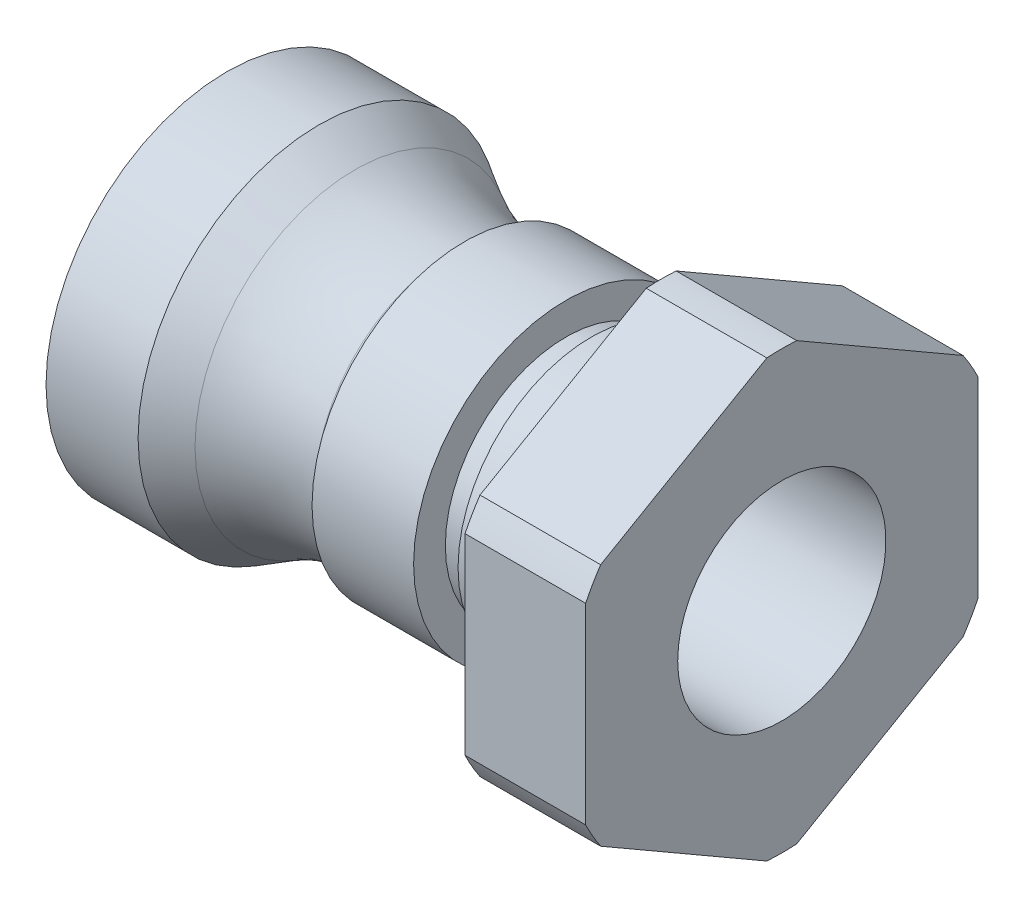
ISO-10303-21;
HEADER;
FILE_DESCRIPTION(('STEP AP214'),'2;1');
FILE_NAME('part.step','',(''),(''),'','','');
FILE_SCHEMA(('AUTOMOTIVE_DESIGN { 1 0 10303 214 1 1 1 1 }'));
ENDSEC;
DATA;
#1=APPLICATION_CONTEXT('core data for automotive mechanical design processes');
#2=APPLICATION_PROTOCOL_DEFINITION('international standard','automotive_design',2000,#1);
#3=PRODUCT_CONTEXT('',#1,'mechanical');
#4=PRODUCT('Part','Part','',(#3));
#5=PRODUCT_RELATED_PRODUCT_CATEGORY('part','',(#4));
#6=PRODUCT_DEFINITION_FORMATION('','',#4);
#7=PRODUCT_DEFINITION_CONTEXT('part definition',#1,'design');
#8=PRODUCT_DEFINITION('design','',#6,#7);
#9=PRODUCT_DEFINITION_SHAPE('','',#8);
#10=(LENGTH_UNIT() NAMED_UNIT(*) SI_UNIT(.MILLI.,.METRE.));
#11=(NAMED_UNIT(*) PLANE_ANGLE_UNIT() SI_UNIT($,.RADIAN.));
#12=(NAMED_UNIT(*) SI_UNIT($,.STERADIAN.) SOLID_ANGLE_UNIT());
#13=UNCERTAINTY_MEASURE_WITH_UNIT(LENGTH_MEASURE(1.E-05),#10,'distance_accuracy_value','');
#14=(GEOMETRIC_REPRESENTATION_CONTEXT(3) GLOBAL_UNCERTAINTY_ASSIGNED_CONTEXT((#13)) GLOBAL_UNIT_ASSIGNED_CONTEXT((#10,
#11,#12)) REPRESENTATION_CONTEXT('',''));
#15=CARTESIAN_POINT('',(0.,0.,0.));
#16=DIRECTION('',(0.,0.,1.));
#17=DIRECTION('',(1.,0.,0.));
#18=AXIS2_PLACEMENT_3D('',#15,#16,#17);
#19=CARTESIAN_POINT('',(11.0998,4.3688,0.));
#20=DIRECTION('',(-1.,0.,0.));
#21=DIRECTION('',(0.,0.,1.));
#22=AXIS2_PLACEMENT_3D('',#19,#20,#21);
#23=PLANE('',#22);
#24=CARTESIAN_POINT('',(11.0998,0.,0.));
#25=DIRECTION('',(-1.,0.,0.));
#26=DIRECTION('',(0.,0.,1.));
#27=AXIS2_PLACEMENT_3D('',#24,#25,#26);
#28=CIRCLE('',#27,2.0828);
#29=CARTESIAN_POINT('',(11.0998,0.,2.0828));
#30=VERTEX_POINT('',#29);
#31=EDGE_CURVE('P0_E36',#30,#30,#28,.T.);
#32=ORIENTED_EDGE('',*,*,#31,.T.);
#33=EDGE_LOOP('',(#32));
#34=FACE_BOUND('',#33,.T.);
#35=DIRECTION('',(0.,0.5,-0.866025403784439));
#36=VECTOR('',#35,1.);
#37=CARTESIAN_POINT('',(11.0998,-4.5313913227617,0.));
#38=LINE('',#37,#36);
#39=CARTESIAN_POINT('',(11.0998,-4.35852825106488,-0.299407622931314));
#40=VERTEX_POINT('',#39);
#41=CARTESIAN_POINT('',(11.0998,-2.43855873307767,-3.62489237706868));
#42=VERTEX_POINT('',#41);
#43=EDGE_CURVE('P0_E187',#40,#42,#38,.T.);
#44=ORIENTED_EDGE('',*,*,#43,.T.);
#45=CARTESIAN_POINT('',(11.0998,0.,0.));
#46=DIRECTION('',(-1.,0.,0.));
#47=DIRECTION('',(0.,0.,1.));
#48=AXIS2_PLACEMENT_3D('',#45,#46,#47);
#49=CIRCLE('',#48,4.3688);
#50=CARTESIAN_POINT('',(11.0998,-1.9199695179872,-3.9243));
#51=VERTEX_POINT('',#50);
#52=EDGE_CURVE('P0_E25',#51,#42,#49,.T.);
#53=ORIENTED_EDGE('',*,*,#52,.F.);
#54=DIRECTION('',(0.,1.,0.));
#55=VECTOR('',#54,1.);
#56=CARTESIAN_POINT('',(11.0998,-2.26569566138085,-3.9243));
#57=LINE('',#56,#55);
#58=CARTESIAN_POINT('',(11.0998,1.9199695179872,-3.9243));
#59=VERTEX_POINT('',#58);
#60=EDGE_CURVE('P0_E222',#51,#59,#57,.T.);
#61=ORIENTED_EDGE('',*,*,#60,.T.);
#62=CARTESIAN_POINT('',(11.0998,0.,0.));
#63=DIRECTION('',(-1.,0.,0.));
#64=DIRECTION('',(0.,0.,1.));
#65=AXIS2_PLACEMENT_3D('',#62,#63,#64);
#66=CIRCLE('',#65,4.3688);
#67=CARTESIAN_POINT('',(11.0998,2.43855873307767,-3.62489237706869));
#68=VERTEX_POINT('',#67);
#69=EDGE_CURVE('P0_E294',#68,#59,#66,.T.);
#70=ORIENTED_EDGE('',*,*,#69,.F.);
#71=DIRECTION('',(0.,0.5,0.866025403784439));
#72=VECTOR('',#71,1.);
#73=CARTESIAN_POINT('',(11.0998,2.26569566138085,-3.9243));
#74=LINE('',#73,#72);
#75=CARTESIAN_POINT('',(11.0998,4.35852825106488,-0.299407622931317));
#76=VERTEX_POINT('',#75);
#77=EDGE_CURVE('P0_E316',#68,#76,#74,.T.);
#78=ORIENTED_EDGE('',*,*,#77,.T.);
#79=CARTESIAN_POINT('',(11.0998,0.,0.));
#80=DIRECTION('',(-1.,0.,0.));
#81=DIRECTION('',(0.,0.,1.));
#82=AXIS2_PLACEMENT_3D('',#79,#80,#81);
#83=CIRCLE('',#82,4.3688);
#84=CARTESIAN_POINT('',(11.0998,4.35852825106488,0.299407622931321));
#85=VERTEX_POINT('',#84);
#86=EDGE_CURVE('P0_E291',#85,#76,#83,.T.);
#87=ORIENTED_EDGE('',*,*,#86,.F.);
#88=DIRECTION('',(0.,-0.5,0.866025403784439));
#89=VECTOR('',#88,1.);
#90=CARTESIAN_POINT('',(11.0998,4.5313913227617,0.));
#91=LINE('',#90,#89);
#92=CARTESIAN_POINT('',(11.0998,2.43855873307768,3.62489237706868));
#93=VERTEX_POINT('',#92);
#94=EDGE_CURVE('P0_E237',#85,#93,#91,.T.);
#95=ORIENTED_EDGE('',*,*,#94,.T.);
#96=CARTESIAN_POINT('',(11.0998,0.,0.));
#97=DIRECTION('',(-1.,0.,0.));
#98=DIRECTION('',(0.,0.,1.));
#99=AXIS2_PLACEMENT_3D('',#96,#97,#98);
#100=CIRCLE('',#99,4.3688);
#101=CARTESIAN_POINT('',(11.0998,1.9199695179872,3.9243));
#102=VERTEX_POINT('',#101);
#103=EDGE_CURVE('P0_E288',#102,#93,#100,.T.);
#104=ORIENTED_EDGE('',*,*,#103,.F.);
#105=DIRECTION('',(0.,-1.,0.));
#106=VECTOR('',#105,1.);
#107=CARTESIAN_POINT('',(11.0998,2.26569566138085,3.9243));
#108=LINE('',#107,#106);
#109=CARTESIAN_POINT('',(11.0998,-1.91996951798719,3.9243));
#110=VERTEX_POINT('',#109);
#111=EDGE_CURVE('P0_E260',#102,#110,#108,.T.);
#112=ORIENTED_EDGE('',*,*,#111,.T.);
#113=CARTESIAN_POINT('',(11.0998,0.,0.));
#114=DIRECTION('',(-1.,0.,0.));
#115=DIRECTION('',(0.,0.,1.));
#116=AXIS2_PLACEMENT_3D('',#113,#114,#115);
#117=CIRCLE('',#116,4.3688);
#118=CARTESIAN_POINT('',(11.0998,-2.43855873307767,3.62489237706868));
#119=VERTEX_POINT('',#118);
#120=EDGE_CURVE('P0_E285',#119,#110,#117,.T.);
#121=ORIENTED_EDGE('',*,*,#120,.F.);
#122=DIRECTION('',(0.,-0.5,-0.866025403784439));
#123=VECTOR('',#122,1.);
#124=CARTESIAN_POINT('',(11.0998,-2.26569566138085,3.9243));
#125=LINE('',#124,#123);
#126=CARTESIAN_POINT('',(11.0998,-4.35852825106488,0.299407622931322));
#127=VERTEX_POINT('',#126);
#128=EDGE_CURVE('P0_E272',#119,#127,#125,.T.);
#129=ORIENTED_EDGE('',*,*,#128,.T.);
#130=CARTESIAN_POINT('',(11.0998,0.,0.));
#131=DIRECTION('',(-1.,0.,0.));
#132=DIRECTION('',(0.,0.,1.));
#133=AXIS2_PLACEMENT_3D('',#130,#131,#132);
#134=CIRCLE('',#133,4.3688);
#135=EDGE_CURVE('P0_E11',#40,#127,#134,.T.);
#136=ORIENTED_EDGE('',*,*,#135,.F.);
#137=EDGE_LOOP('',(#44,#53,#61,#70,#78,#87,#95,#104,#112,#121,#129,#136));
#138=FACE_BOUND('',#137,.T.);
#139=ADVANCED_FACE('P0_F17',(#34,#138),#23,.F.);
#140=CARTESIAN_POINT('',(0.,0.,0.));
#141=DIRECTION('',(-1.,0.,0.));
#142=DIRECTION('',(0.,0.,1.));
#143=AXIS2_PLACEMENT_3D('',#140,#141,#142);
#144=CYLINDRICAL_SURFACE('',#143,4.3688);
#145=DIRECTION('',(-1.,0.,0.));
#146=VECTOR('',#145,1.);
#147=CARTESIAN_POINT('',(0.,-4.35852825106488,-0.299407622931314));
#148=LINE('',#147,#146);
#149=CARTESIAN_POINT('',(8.6868,-4.35852825106488,-0.299407622931317));
#150=VERTEX_POINT('',#149);
#151=EDGE_CURVE('P0_E164',#40,#150,#148,.T.);
#152=ORIENTED_EDGE('',*,*,#151,.F.);
#153=ORIENTED_EDGE('',*,*,#135,.T.);
#154=DIRECTION('',(1.,0.,0.));
#155=VECTOR('',#154,1.);
#156=CARTESIAN_POINT('',(0.,-4.35852825106488,0.299407622931321));
#157=LINE('',#156,#155);
#158=CARTESIAN_POINT('',(8.6868,-4.35852825106487,0.299407622931323));
#159=VERTEX_POINT('',#158);
#160=EDGE_CURVE('P0_E166',#159,#127,#157,.T.);
#161=ORIENTED_EDGE('',*,*,#160,.F.);
#162=CARTESIAN_POINT('',(8.6868,0.,0.));
#163=DIRECTION('',(-1.,0.,0.));
#164=DIRECTION('',(0.,0.,1.));
#165=AXIS2_PLACEMENT_3D('',#162,#163,#164);
#166=CIRCLE('',#165,4.3688);
#167=EDGE_CURVE('P0_E160',#150,#159,#166,.T.);
#168=ORIENTED_EDGE('',*,*,#167,.F.);
#169=EDGE_LOOP('',(#152,#153,#161,#168));
#170=FACE_BOUND('',#169,.T.);
#171=ADVANCED_FACE('P0_F162',(#170),#144,.T.);
#172=CARTESIAN_POINT('',(0.,0.,0.));
#173=DIRECTION('',(-1.,0.,0.));
#174=DIRECTION('',(0.,0.,1.));
#175=AXIS2_PLACEMENT_3D('',#172,#173,#174);
#176=CYLINDRICAL_SURFACE('',#175,4.3688);
#177=DIRECTION('',(1.,0.,0.));
#178=VECTOR('',#177,1.);
#179=CARTESIAN_POINT('',(0.,-2.43855873307767,-3.62489237706869));
#180=LINE('',#179,#178);
#181=CARTESIAN_POINT('',(8.6868,-2.43855873307767,-3.62489237706868));
#182=VERTEX_POINT('',#181);
#183=EDGE_CURVE('P0_E182',#182,#42,#180,.T.);
#184=ORIENTED_EDGE('',*,*,#183,.F.);
#185=CARTESIAN_POINT('',(8.6868,0.,0.));
#186=DIRECTION('',(-1.,0.,0.));
#187=DIRECTION('',(0.,0.,1.));
#188=AXIS2_PLACEMENT_3D('',#185,#186,#187);
#189=CIRCLE('',#188,4.3688);
#190=CARTESIAN_POINT('',(8.6868,-1.9199695179872,-3.9243));
#191=VERTEX_POINT('',#190);
#192=EDGE_CURVE('P0_E177',#191,#182,#189,.T.);
#193=ORIENTED_EDGE('',*,*,#192,.F.);
#194=DIRECTION('',(-1.,0.,0.));
#195=VECTOR('',#194,1.);
#196=CARTESIAN_POINT('',(0.,-1.9199695179872,-3.9243));
#197=LINE('',#196,#195);
#198=EDGE_CURVE('P0_E204',#51,#191,#197,.T.);
#199=ORIENTED_EDGE('',*,*,#198,.F.);
#200=ORIENTED_EDGE('',*,*,#52,.T.);
#201=EDGE_LOOP('',(#184,#193,#199,#200));
#202=FACE_BOUND('',#201,.T.);
#203=ADVANCED_FACE('P0_F301',(#202),#176,.T.);
#204=CARTESIAN_POINT('',(0.,0.,0.));
#205=DIRECTION('',(-1.,0.,0.));
#206=DIRECTION('',(0.,0.,1.));
#207=AXIS2_PLACEMENT_3D('',#204,#205,#206);
#208=CYLINDRICAL_SURFACE('',#207,4.3688);
#209=DIRECTION('',(1.,0.,0.));
#210=VECTOR('',#209,1.);
#211=CARTESIAN_POINT('',(0.,1.9199695179872,-3.9243));
#212=LINE('',#211,#210);
#213=CARTESIAN_POINT('',(8.6868,1.9199695179872,-3.9243));
#214=VERTEX_POINT('',#213);
#215=EDGE_CURVE('P0_E214',#214,#59,#212,.T.);
#216=ORIENTED_EDGE('',*,*,#215,.F.);
#217=CARTESIAN_POINT('',(8.6868,0.,0.));
#218=DIRECTION('',(-1.,0.,0.));
#219=DIRECTION('',(0.,0.,1.));
#220=AXIS2_PLACEMENT_3D('',#217,#218,#219);
#221=CIRCLE('',#220,4.3688);
#222=CARTESIAN_POINT('',(8.6868,2.43855873307768,-3.62489237706868));
#223=VERTEX_POINT('',#222);
#224=EDGE_CURVE('P0_E218',#223,#214,#221,.T.);
#225=ORIENTED_EDGE('',*,*,#224,.F.);
#226=DIRECTION('',(-1.,0.,0.));
#227=VECTOR('',#226,1.);
#228=CARTESIAN_POINT('',(0.,2.43855873307767,-3.62489237706868));
#229=LINE('',#228,#227);
#230=EDGE_CURVE('P0_E232',#68,#223,#229,.T.);
#231=ORIENTED_EDGE('',*,*,#230,.F.);
#232=ORIENTED_EDGE('',*,*,#69,.T.);
#233=EDGE_LOOP('',(#216,#225,#231,#232));
#234=FACE_BOUND('',#233,.T.);
#235=ADVANCED_FACE('P0_F347',(#234),#208,.T.);
#236=CARTESIAN_POINT('',(0.,0.,0.));
#237=DIRECTION('',(-1.,0.,0.));
#238=DIRECTION('',(0.,0.,1.));
#239=AXIS2_PLACEMENT_3D('',#236,#237,#238);
#240=CYLINDRICAL_SURFACE('',#239,4.3688);
#241=DIRECTION('',(1.,0.,0.));
#242=VECTOR('',#241,1.);
#243=CARTESIAN_POINT('',(0.,4.35852825106488,-0.299407622931317));
#244=LINE('',#243,#242);
#245=CARTESIAN_POINT('',(8.6868,4.35852825106487,-0.299407622931321));
#246=VERTEX_POINT('',#245);
#247=EDGE_CURVE('P0_E245',#246,#76,#244,.T.);
#248=ORIENTED_EDGE('',*,*,#247,.F.);
#249=CARTESIAN_POINT('',(8.6868,0.,0.));
#250=DIRECTION('',(-1.,0.,0.));
#251=DIRECTION('',(0.,0.,1.));
#252=AXIS2_PLACEMENT_3D('',#249,#250,#251);
#253=CIRCLE('',#252,4.3688);
#254=CARTESIAN_POINT('',(8.6868,4.35852825106488,0.299407622931326));
#255=VERTEX_POINT('',#254);
#256=EDGE_CURVE('P0_E215',#255,#246,#253,.T.);
#257=ORIENTED_EDGE('',*,*,#256,.F.);
#258=DIRECTION('',(-1.,0.,0.));
#259=VECTOR('',#258,1.);
#260=CARTESIAN_POINT('',(0.,4.35852825106488,0.29940762293132));
#261=LINE('',#260,#259);
#262=EDGE_CURVE('P0_E228',#85,#255,#261,.T.);
#263=ORIENTED_EDGE('',*,*,#262,.F.);
#264=ORIENTED_EDGE('',*,*,#86,.T.);
#265=EDGE_LOOP('',(#248,#257,#263,#264));
#266=FACE_BOUND('',#265,.T.);
#267=ADVANCED_FACE('P0_F333',(#266),#240,.T.);
#268=CARTESIAN_POINT('',(0.,0.,0.));
#269=DIRECTION('',(-1.,0.,0.));
#270=DIRECTION('',(0.,0.,1.));
#271=AXIS2_PLACEMENT_3D('',#268,#269,#270);
#272=CYLINDRICAL_SURFACE('',#271,4.3688);
#273=DIRECTION('',(1.,0.,0.));
#274=VECTOR('',#273,1.);
#275=CARTESIAN_POINT('',(0.,2.43855873307768,3.62489237706868));
#276=LINE('',#275,#274);
#277=CARTESIAN_POINT('',(8.6868,2.43855873307768,3.62489237706867));
#278=VERTEX_POINT('',#277);
#279=EDGE_CURVE('P0_E227',#278,#93,#276,.T.);
#280=ORIENTED_EDGE('',*,*,#279,.F.);
#281=CARTESIAN_POINT('',(8.6868,0.,0.));
#282=DIRECTION('',(-1.,0.,0.));
#283=DIRECTION('',(0.,0.,1.));
#284=AXIS2_PLACEMENT_3D('',#281,#282,#283);
#285=CIRCLE('',#284,4.3688);
#286=CARTESIAN_POINT('',(8.6868,1.9199695179872,3.9243));
#287=VERTEX_POINT('',#286);
#288=EDGE_CURVE('P0_E200',#287,#278,#285,.T.);
#289=ORIENTED_EDGE('',*,*,#288,.F.);
#290=DIRECTION('',(-1.,0.,0.));
#291=VECTOR('',#290,1.);
#292=CARTESIAN_POINT('',(0.,1.9199695179872,3.9243));
#293=LINE('',#292,#291);
#294=EDGE_CURVE('P0_E241',#102,#287,#293,.T.);
#295=ORIENTED_EDGE('',*,*,#294,.F.);
#296=ORIENTED_EDGE('',*,*,#103,.T.);
#297=EDGE_LOOP('',(#280,#289,#295,#296));
#298=FACE_BOUND('',#297,.T.);
#299=ADVANCED_FACE('P0_F339',(#298),#272,.T.);
#300=CARTESIAN_POINT('',(0.,0.,0.));
#301=DIRECTION('',(-1.,0.,0.));
#302=DIRECTION('',(0.,0.,1.));
#303=AXIS2_PLACEMENT_3D('',#300,#301,#302);
#304=CYLINDRICAL_SURFACE('',#303,4.3688);
#305=DIRECTION('',(1.,0.,0.));
#306=VECTOR('',#305,1.);
#307=CARTESIAN_POINT('',(0.,-1.9199695179872,3.9243));
#308=LINE('',#307,#306);
#309=CARTESIAN_POINT('',(8.6868,-1.9199695179872,3.9243));
#310=VERTEX_POINT('',#309);
#311=EDGE_CURVE('P0_E256',#310,#110,#308,.T.);
#312=ORIENTED_EDGE('',*,*,#311,.F.);
#313=CARTESIAN_POINT('',(8.6868,0.,0.));
#314=DIRECTION('',(-1.,0.,0.));
#315=DIRECTION('',(0.,0.,1.));
#316=AXIS2_PLACEMENT_3D('',#313,#314,#315);
#317=CIRCLE('',#316,4.3688);
#318=CARTESIAN_POINT('',(8.6868,-2.43855873307768,3.62489237706868));
#319=VERTEX_POINT('',#318);
#320=EDGE_CURVE('P0_E171',#319,#310,#317,.T.);
#321=ORIENTED_EDGE('',*,*,#320,.F.);
#322=DIRECTION('',(-1.,0.,0.));
#323=VECTOR('',#322,1.);
#324=CARTESIAN_POINT('',(0.,-2.43855873307767,3.62489237706868));
#325=LINE('',#324,#323);
#326=EDGE_CURVE('P0_E264',#119,#319,#325,.T.);
#327=ORIENTED_EDGE('',*,*,#326,.F.);
#328=ORIENTED_EDGE('',*,*,#120,.T.);
#329=EDGE_LOOP('',(#312,#321,#327,#328));
#330=FACE_BOUND('',#329,.T.);
#331=ADVANCED_FACE('P0_F375',(#330),#304,.T.);
#332=CARTESIAN_POINT('',(8.6868,4.3688,0.));
#333=DIRECTION('',(1.,0.,0.));
#334=DIRECTION('',(0.,1.,0.));
#335=AXIS2_PLACEMENT_3D('',#332,#333,#334);
#336=PLANE('',#335);
#337=CARTESIAN_POINT('',(8.6868,0.,0.));
#338=DIRECTION('',(-1.,0.,0.));
#339=DIRECTION('',(0.,0.,1.));
#340=AXIS2_PLACEMENT_3D('',#337,#338,#339);
#341=CIRCLE('',#340,2.667);
#342=CARTESIAN_POINT('',(8.6868,0.,2.667));
#343=VERTEX_POINT('',#342);
#344=EDGE_CURVE('P0_E44',#343,#343,#341,.T.);
#345=ORIENTED_EDGE('',*,*,#344,.F.);
#346=EDGE_LOOP('',(#345));
#347=FACE_BOUND('',#346,.T.);
#348=DIRECTION('',(0.,0.5,-0.866025403784439));
#349=VECTOR('',#348,1.);
#350=CARTESIAN_POINT('',(8.6868,-2.30634349207127,-3.85389589202673));
#351=LINE('',#350,#349);
#352=EDGE_CURVE('P0_E174',#150,#182,#351,.T.);
#353=ORIENTED_EDGE('',*,*,#352,.F.);
#354=ORIENTED_EDGE('',*,*,#167,.T.);
#355=DIRECTION('',(0.,-0.5,-0.866025403784439));
#356=VECTOR('',#355,1.);
#357=CARTESIAN_POINT('',(8.6868,-2.30634349207127,3.85389589202673));
#358=LINE('',#357,#356);
#359=EDGE_CURVE('P0_E265',#319,#159,#358,.T.);
#360=ORIENTED_EDGE('',*,*,#359,.F.);
#361=ORIENTED_EDGE('',*,*,#320,.T.);
#362=DIRECTION('',(0.,-1.,0.));
#363=VECTOR('',#362,1.);
#364=CARTESIAN_POINT('',(8.6868,4.3688,3.9243));
#365=LINE('',#364,#363);
#366=EDGE_CURVE('P0_E252',#287,#310,#365,.T.);
#367=ORIENTED_EDGE('',*,*,#366,.F.);
#368=ORIENTED_EDGE('',*,*,#288,.T.);
#369=DIRECTION('',(0.,-0.5,0.866025403784439));
#370=VECTOR('',#369,1.);
#371=CARTESIAN_POINT('',(8.6868,4.49074349207127,0.0704041079732726));
#372=LINE('',#371,#370);
#373=EDGE_CURVE('P0_E223',#255,#278,#372,.T.);
#374=ORIENTED_EDGE('',*,*,#373,.F.);
#375=ORIENTED_EDGE('',*,*,#256,.T.);
#376=DIRECTION('',(0.,0.5,0.866025403784439));
#377=VECTOR('',#376,1.);
#378=CARTESIAN_POINT('',(8.6868,4.49074349207127,-0.0704041079732716));
#379=LINE('',#378,#377);
#380=EDGE_CURVE('P0_E236',#223,#246,#379,.T.);
#381=ORIENTED_EDGE('',*,*,#380,.F.);
#382=ORIENTED_EDGE('',*,*,#224,.T.);
#383=DIRECTION('',(0.,1.,0.));
#384=VECTOR('',#383,1.);
#385=CARTESIAN_POINT('',(8.6868,4.3688,-3.9243));
#386=LINE('',#385,#384);
#387=EDGE_CURVE('P0_E207',#191,#214,#386,.T.);
#388=ORIENTED_EDGE('',*,*,#387,.F.);
#389=ORIENTED_EDGE('',*,*,#192,.T.);
#390=EDGE_LOOP('',(#353,#354,#360,#361,#367,#368,#374,#375,#381,#382,#388,#389));
#391=FACE_BOUND('',#390,.T.);
#392=ADVANCED_FACE('P0_F175',(#347,#391),#336,.F.);
#393=CARTESIAN_POINT('',(0.,0.,0.));
#394=DIRECTION('',(-1.,0.,0.));
#395=DIRECTION('',(0.,0.,1.));
#396=AXIS2_PLACEMENT_3D('',#393,#394,#395);
#397=CYLINDRICAL_SURFACE('',#396,2.0828);
#398=CARTESIAN_POINT('',(6.7818,0.,0.));
#399=DIRECTION('',(-1.,0.,0.));
#400=DIRECTION('',(0.,0.,-1.));
#401=AXIS2_PLACEMENT_3D('',#398,#399,#400);
#402=CIRCLE('',#401,2.0828);
#403=CARTESIAN_POINT('',(6.7818,0.,-2.0828));
#404=VERTEX_POINT('',#403);
#405=EDGE_CURVE('P0_E189',#404,#404,#402,.T.);
#406=ORIENTED_EDGE('',*,*,#405,.T.);
#407=EDGE_LOOP('',(#406));
#408=FACE_BOUND('',#407,.T.);
#409=ORIENTED_EDGE('',*,*,#31,.F.);
#410=EDGE_LOOP('',(#409));
#411=FACE_BOUND('',#410,.T.);
#412=ADVANCED_FACE('P0_F378',(#408,#411),#397,.F.);
#413=CARTESIAN_POINT('',(0.,0.,0.));
#414=DIRECTION('',(-1.,0.,0.));
#415=DIRECTION('',(0.,0.,1.));
#416=AXIS2_PLACEMENT_3D('',#413,#414,#415);
#417=CYLINDRICAL_SURFACE('',#416,2.667);
#418=CARTESIAN_POINT('',(7.2898,0.,0.));
#419=DIRECTION('',(-1.,0.,0.));
#420=DIRECTION('',(0.,0.,1.));
#421=AXIS2_PLACEMENT_3D('',#418,#419,#420);
#422=CIRCLE('',#421,2.667);
#423=CARTESIAN_POINT('',(7.2898,0.,2.667));
#424=VERTEX_POINT('',#423);
#425=EDGE_CURVE('P0_E203',#424,#424,#422,.T.);
#426=ORIENTED_EDGE('',*,*,#425,.F.);
#427=EDGE_LOOP('',(#426));
#428=FACE_BOUND('',#427,.T.);
#429=ORIENTED_EDGE('',*,*,#344,.T.);
#430=EDGE_LOOP('',(#429));
#431=FACE_BOUND('',#430,.T.);
#432=ADVANCED_FACE('P0_F381',(#428,#431),#417,.T.);
#433=CARTESIAN_POINT('',(7.2898,2.413,0.));
#434=DIRECTION('',(1.,0.,0.));
#435=DIRECTION('',(0.,1.,0.));
#436=AXIS2_PLACEMENT_3D('',#433,#434,#435);
#437=PLANE('',#436);
#438=CARTESIAN_POINT('',(7.2898,0.,0.));
#439=DIRECTION('',(-1.,0.,0.));
#440=DIRECTION('',(0.,0.,1.));
#441=AXIS2_PLACEMENT_3D('',#438,#439,#440);
#442=CIRCLE('',#441,2.413);
#443=CARTESIAN_POINT('',(7.2898,0.,2.413));
#444=VERTEX_POINT('',#443);
#445=EDGE_CURVE('P0_E276',#444,#444,#442,.T.);
#446=ORIENTED_EDGE('',*,*,#445,.F.);
#447=EDGE_LOOP('',(#446));
#448=FACE_BOUND('',#447,.T.);
#449=ORIENTED_EDGE('',*,*,#425,.T.);
#450=EDGE_LOOP('',(#449));
#451=FACE_BOUND('',#450,.T.);
#452=ADVANCED_FACE('P0_F392',(#448,#451),#437,.F.);
#453=CARTESIAN_POINT('',(0.,0.,0.));
#454=DIRECTION('',(-1.,0.,0.));
#455=DIRECTION('',(0.,0.,1.));
#456=AXIS2_PLACEMENT_3D('',#453,#454,#455);
#457=CYLINDRICAL_SURFACE('',#456,2.413);
#458=CARTESIAN_POINT('',(6.7818,0.,0.));
#459=DIRECTION('',(-1.,0.,0.));
#460=DIRECTION('',(0.,0.,1.));
#461=AXIS2_PLACEMENT_3D('',#458,#459,#460);
#462=CIRCLE('',#461,2.413);
#463=CARTESIAN_POINT('',(6.7818,0.,2.413));
#464=VERTEX_POINT('',#463);
#465=EDGE_CURVE('P0_E196',#464,#464,#462,.T.);
#466=ORIENTED_EDGE('',*,*,#465,.F.);
#467=EDGE_LOOP('',(#466));
#468=FACE_BOUND('',#467,.T.);
#469=ORIENTED_EDGE('',*,*,#445,.T.);
#470=EDGE_LOOP('',(#469));
#471=FACE_BOUND('',#470,.T.);
#472=ADVANCED_FACE('P0_F390',(#468,#471),#457,.T.);
#473=CARTESIAN_POINT('',(-4.04346942248688,-2.26569566138085,3.9243));
#474=DIRECTION('',(0.,-0.866025403784439,0.5));
#475=DIRECTION('',(-1.,0.,0.));
#476=AXIS2_PLACEMENT_3D('',#473,#474,#475);
#477=PLANE('',#476);
#478=ORIENTED_EDGE('',*,*,#326,.T.);
#479=ORIENTED_EDGE('',*,*,#359,.T.);
#480=ORIENTED_EDGE('',*,*,#160,.T.);
#481=ORIENTED_EDGE('',*,*,#128,.F.);
#482=EDGE_LOOP('',(#478,#479,#480,#481));
#483=FACE_BOUND('',#482,.T.);
#484=ADVANCED_FACE('P0_F386',(#483),#477,.T.);
#485=CARTESIAN_POINT('',(-4.04346942248688,2.26569566138085,3.9243));
#486=DIRECTION('',(0.,0.,1.));
#487=DIRECTION('',(1.,0.,0.));
#488=AXIS2_PLACEMENT_3D('',#485,#486,#487);
#489=PLANE('',#488);
#490=ORIENTED_EDGE('',*,*,#294,.T.);
#491=ORIENTED_EDGE('',*,*,#366,.T.);
#492=ORIENTED_EDGE('',*,*,#311,.T.);
#493=ORIENTED_EDGE('',*,*,#111,.F.);
#494=EDGE_LOOP('',(#490,#491,#492,#493));
#495=FACE_BOUND('',#494,.T.);
#496=ADVANCED_FACE('P0_F383',(#495),#489,.T.);
#497=CARTESIAN_POINT('',(-4.04346942248688,4.5313913227617,0.));
#498=DIRECTION('',(0.,0.866025403784439,0.5));
#499=DIRECTION('',(1.,0.,0.));
#500=AXIS2_PLACEMENT_3D('',#497,#498,#499);
#501=PLANE('',#500);
#502=ORIENTED_EDGE('',*,*,#262,.T.);
#503=ORIENTED_EDGE('',*,*,#373,.T.);
#504=ORIENTED_EDGE('',*,*,#279,.T.);
#505=ORIENTED_EDGE('',*,*,#94,.F.);
#506=EDGE_LOOP('',(#502,#503,#504,#505));
#507=FACE_BOUND('',#506,.T.);
#508=ADVANCED_FACE('P0_F329',(#507),#501,.T.);
#509=CARTESIAN_POINT('',(-4.04346942248688,2.26569566138085,-3.9243));
#510=DIRECTION('',(0.,0.866025403784439,-0.5));
#511=DIRECTION('',(-1.,0.,0.));
#512=AXIS2_PLACEMENT_3D('',#509,#510,#511);
#513=PLANE('',#512);
#514=ORIENTED_EDGE('',*,*,#230,.T.);
#515=ORIENTED_EDGE('',*,*,#380,.T.);
#516=ORIENTED_EDGE('',*,*,#247,.T.);
#517=ORIENTED_EDGE('',*,*,#77,.F.);
#518=EDGE_LOOP('',(#514,#515,#516,#517));
#519=FACE_BOUND('',#518,.T.);
#520=ADVANCED_FACE('P0_F344',(#519),#513,.T.);
#521=CARTESIAN_POINT('',(-4.04346942248688,-2.26569566138085,-3.9243));
#522=DIRECTION('',(0.,0.,-1.));
#523=DIRECTION('',(0.,-1.,0.));
#524=AXIS2_PLACEMENT_3D('',#521,#522,#523);
#525=PLANE('',#524);
#526=ORIENTED_EDGE('',*,*,#198,.T.);
#527=ORIENTED_EDGE('',*,*,#387,.T.);
#528=ORIENTED_EDGE('',*,*,#215,.T.);
#529=ORIENTED_EDGE('',*,*,#60,.F.);
#530=EDGE_LOOP('',(#526,#527,#528,#529));
#531=FACE_BOUND('',#530,.T.);
#532=ADVANCED_FACE('P0_F349',(#531),#525,.T.);
#533=CARTESIAN_POINT('',(-4.04346942248688,-4.5313913227617,0.));
#534=DIRECTION('',(0.,-0.866025403784439,-0.5));
#535=DIRECTION('',(0.,0.5,-0.866025403784439));
#536=AXIS2_PLACEMENT_3D('',#533,#534,#535);
#537=PLANE('',#536);
#538=ORIENTED_EDGE('',*,*,#151,.T.);
#539=ORIENTED_EDGE('',*,*,#352,.T.);
#540=ORIENTED_EDGE('',*,*,#183,.T.);
#541=ORIENTED_EDGE('',*,*,#43,.F.);
#542=EDGE_LOOP('',(#538,#539,#540,#541));
#543=FACE_BOUND('',#542,.T.);
#544=ADVANCED_FACE('P0_F185',(#543),#537,.T.);
#545=CARTESIAN_POINT('',(6.7818,0.,0.));
#546=DIRECTION('',(1.,0.,0.));
#547=DIRECTION('',(0.,1.,0.));
#548=AXIS2_PLACEMENT_3D('',#545,#546,#547);
#549=PLANE('',#548);
#550=ORIENTED_EDGE('',*,*,#405,.F.);
#551=EDGE_LOOP('',(#550));
#552=FACE_BOUND('',#551,.T.);
#553=ORIENTED_EDGE('',*,*,#465,.T.);
#554=EDGE_LOOP('',(#553));
#555=FACE_BOUND('',#554,.T.);
#556=ADVANCED_FACE('P0_F357',(#552,#555),#549,.F.);
#557=CLOSED_SHELL('',(#139,#171,#203,#235,#267,#299,#331,#392,#412,#432,#452,#472,#484,#496,
#508,#520,#532,#544,#556));
#558=MANIFOLD_SOLID_BREP('P0_B1',#557);
#559=CARTESIAN_POINT('',(6.7818,0.,0.));
#560=DIRECTION('',(1.,0.,0.));
#561=DIRECTION('',(0.,1.,0.));
#562=AXIS2_PLACEMENT_3D('',#559,#560,#561);
#563=PLANE('',#562);
#564=CARTESIAN_POINT('',(6.7818,0.,0.));
#565=DIRECTION('',(-1.,0.,0.));
#566=DIRECTION('',(0.,0.,-1.));
#567=AXIS2_PLACEMENT_3D('',#564,#565,#566);
#568=CIRCLE('',#567,2.0828);
#569=CARTESIAN_POINT('',(6.7818,0.,-2.0828));
#570=VERTEX_POINT('',#569);
#571=EDGE_CURVE('P1_E95',#570,#570,#568,.T.);
#572=ORIENTED_EDGE('',*,*,#571,.T.);
#573=EDGE_LOOP('',(#572));
#574=FACE_BOUND('',#573,.T.);
#575=CARTESIAN_POINT('',(6.7818,0.,0.));
#576=DIRECTION('',(-1.,0.,0.));
#577=DIRECTION('',(0.,0.,1.));
#578=AXIS2_PLACEMENT_3D('',#575,#576,#577);
#579=CIRCLE('',#578,3.048);
#580=CARTESIAN_POINT('',(6.7818,0.,3.048));
#581=VERTEX_POINT('',#580);
#582=EDGE_CURVE('P1_E11',#581,#581,#579,.T.);
#583=ORIENTED_EDGE('',*,*,#582,.F.);
#584=EDGE_LOOP('',(#583));
#585=FACE_BOUND('',#584,.T.);
#586=ADVANCED_FACE('P1_F17',(#574,#585),#563,.T.);
#587=CARTESIAN_POINT('',(0.,0.,0.));
#588=DIRECTION('',(-1.,0.,0.));
#589=DIRECTION('',(0.,0.,1.));
#590=AXIS2_PLACEMENT_3D('',#587,#588,#589);
#591=CYLINDRICAL_SURFACE('',#590,3.048);
#592=CARTESIAN_POINT('',(4.7498,0.,0.));
#593=DIRECTION('',(-1.,0.,0.));
#594=DIRECTION('',(0.,0.,1.));
#595=AXIS2_PLACEMENT_3D('',#592,#593,#594);
#596=CIRCLE('',#595,3.048);
#597=CARTESIAN_POINT('',(4.7498,0.,3.048));
#598=VERTEX_POINT('',#597);
#599=EDGE_CURVE('P1_E20',#598,#598,#596,.T.);
#600=ORIENTED_EDGE('',*,*,#599,.F.);
#601=EDGE_LOOP('',(#600));
#602=FACE_BOUND('',#601,.T.);
#603=ORIENTED_EDGE('',*,*,#582,.T.);
#604=EDGE_LOOP('',(#603));
#605=FACE_BOUND('',#604,.T.);
#606=ADVANCED_FACE('P1_F120',(#602,#605),#591,.T.);
#607=CARTESIAN_POINT('',(4.7498,2.6924,0.));
#608=DIRECTION('',(1.,0.,0.));
#609=DIRECTION('',(0.,1.,0.));
#610=AXIS2_PLACEMENT_3D('',#607,#608,#609);
#611=PLANE('',#610);
#612=CARTESIAN_POINT('',(4.7498,0.,0.));
#613=DIRECTION('',(1.,0.,0.));
#614=DIRECTION('',(0.,0.,-1.));
#615=AXIS2_PLACEMENT_3D('',#612,#613,#614);
#616=CIRCLE('',#615,2.6924);
#617=CARTESIAN_POINT('',(4.7498,0.,-2.6924));
#618=VERTEX_POINT('',#617);
#619=EDGE_CURVE('P1_E109',#618,#618,#616,.T.);
#620=ORIENTED_EDGE('',*,*,#619,.T.);
#621=EDGE_LOOP('',(#620));
#622=FACE_BOUND('',#621,.T.);
#623=ORIENTED_EDGE('',*,*,#599,.T.);
#624=EDGE_LOOP('',(#623));
#625=FACE_BOUND('',#624,.T.);
#626=ADVANCED_FACE('P1_F118',(#622,#625),#611,.F.);
#627=CARTESIAN_POINT('',(0.,0.,0.));
#628=DIRECTION('',(-1.,0.,0.));
#629=DIRECTION('',(0.,0.,1.));
#630=AXIS2_PLACEMENT_3D('',#627,#628,#629);
#631=CYLINDRICAL_SURFACE('',#630,2.6924);
#632=CARTESIAN_POINT('',(4.46817072685968,0.,0.));
#633=DIRECTION('',(1.,0.,0.));
#634=DIRECTION('',(0.,0.,1.));
#635=AXIS2_PLACEMENT_3D('',#632,#633,#634);
#636=CIRCLE('',#635,2.6924);
#637=CARTESIAN_POINT('',(4.46817072685968,0.,2.6924));
#638=VERTEX_POINT('',#637);
#639=EDGE_CURVE('P1_E57',#638,#638,#636,.T.);
#640=ORIENTED_EDGE('',*,*,#639,.T.);
#641=EDGE_LOOP('',(#640));
#642=FACE_BOUND('',#641,.T.);
#643=ORIENTED_EDGE('',*,*,#619,.F.);
#644=EDGE_LOOP('',(#643));
#645=FACE_BOUND('',#644,.T.);
#646=ADVANCED_FACE('P1_F127',(#642,#645),#631,.T.);
#647=CARTESIAN_POINT('',(4.46817072685968,0.,0.));
#648=DIRECTION('',(-1.,0.,0.));
#649=DIRECTION('',(0.,0.,1.));
#650=AXIS2_PLACEMENT_3D('',#647,#648,#649);
#651=TOROIDAL_SURFACE('',#650,6.5024,3.81);
#652=ORIENTED_EDGE('',*,*,#639,.F.);
#653=EDGE_LOOP('',(#652));
#654=FACE_BOUND('',#653,.T.);
#655=CARTESIAN_POINT('',(2.56317072685968,0.,0.));
#656=DIRECTION('',(-1.,0.,0.));
#657=DIRECTION('',(0.,0.,1.));
#658=AXIS2_PLACEMENT_3D('',#655,#656,#657);
#659=CIRCLE('',#658,3.20284321158129);
#660=CARTESIAN_POINT('',(2.56317072685968,0.,3.20284321158129));
#661=VERTEX_POINT('',#660);
#662=EDGE_CURVE('P1_E67',#661,#661,#659,.T.);
#663=ORIENTED_EDGE('',*,*,#662,.F.);
#664=EDGE_LOOP('',(#663));
#665=FACE_BOUND('',#664,.T.);
#666=ADVANCED_FACE('P1_F146',(#654,#665),#651,.F.);
#667=CARTESIAN_POINT('',(3.4472843036971,0.,0.));
#668=DIRECTION('',(-1.,0.,0.));
#669=DIRECTION('',(0.,0.,1.));
#670=AXIS2_PLACEMENT_3D('',#667,#668,#669);
#671=CONICAL_SURFACE('',#670,2.6924,0.523598775598299);
#672=ORIENTED_EDGE('',*,*,#662,.T.);
#673=EDGE_LOOP('',(#672));
#674=FACE_BOUND('',#673,.T.);
#675=CARTESIAN_POINT('',(1.8415,0.,0.));
#676=DIRECTION('',(-1.,0.,0.));
#677=DIRECTION('',(0.,0.,1.));
#678=AXIS2_PLACEMENT_3D('',#675,#676,#677);
#679=CIRCLE('',#678,3.6195);
#680=CARTESIAN_POINT('',(1.8415,0.,3.6195));
#681=VERTEX_POINT('',#680);
#682=EDGE_CURVE('P1_E161',#681,#681,#679,.T.);
#683=ORIENTED_EDGE('',*,*,#682,.F.);
#684=EDGE_LOOP('',(#683));
#685=FACE_BOUND('',#684,.T.);
#686=ADVANCED_FACE('P1_F134',(#674,#685),#671,.T.);
#687=CARTESIAN_POINT('',(0.,0.,0.));
#688=DIRECTION('',(-1.,0.,0.));
#689=DIRECTION('',(0.,0.,1.));
#690=AXIS2_PLACEMENT_3D('',#687,#688,#689);
#691=CYLINDRICAL_SURFACE('',#690,2.0828);
#692=CARTESIAN_POINT('',(2.667,0.,0.));
#693=DIRECTION('',(-1.,0.,0.));
#694=DIRECTION('',(0.,0.,1.));
#695=AXIS2_PLACEMENT_3D('',#692,#693,#694);
#696=CIRCLE('',#695,2.0828);
#697=CARTESIAN_POINT('',(2.667,0.,2.0828));
#698=VERTEX_POINT('',#697);
#699=EDGE_CURVE('P1_E90',#698,#698,#696,.T.);
#700=ORIENTED_EDGE('',*,*,#699,.T.);
#701=EDGE_LOOP('',(#700));
#702=FACE_BOUND('',#701,.T.);
#703=ORIENTED_EDGE('',*,*,#571,.F.);
#704=EDGE_LOOP('',(#703));
#705=FACE_BOUND('',#704,.T.);
#706=ADVANCED_FACE('P1_F91',(#702,#705),#691,.F.);
#707=CARTESIAN_POINT('',(2.667,2.1717,0.));
#708=DIRECTION('',(1.,0.,0.));
#709=DIRECTION('',(0.,1.,0.));
#710=AXIS2_PLACEMENT_3D('',#707,#708,#709);
#711=PLANE('',#710);
#712=ORIENTED_EDGE('',*,*,#699,.F.);
#713=EDGE_LOOP('',(#712));
#714=FACE_BOUND('',#713,.T.);
#715=CARTESIAN_POINT('',(2.667,0.,0.));
#716=DIRECTION('',(-1.,0.,0.));
#717=DIRECTION('',(0.,0.,1.));
#718=AXIS2_PLACEMENT_3D('',#715,#716,#717);
#719=CIRCLE('',#718,2.1717);
#720=CARTESIAN_POINT('',(2.667,0.,2.1717));
#721=VERTEX_POINT('',#720);
#722=EDGE_CURVE('P1_E84',#721,#721,#719,.T.);
#723=ORIENTED_EDGE('',*,*,#722,.T.);
#724=EDGE_LOOP('',(#723));
#725=FACE_BOUND('',#724,.T.);
#726=ADVANCED_FACE('P1_F133',(#714,#725),#711,.F.);
#727=CARTESIAN_POINT('',(0.,0.,0.));
#728=DIRECTION('',(-1.,0.,0.));
#729=DIRECTION('',(0.,0.,1.));
#730=AXIS2_PLACEMENT_3D('',#727,#728,#729);
#731=CYLINDRICAL_SURFACE('',#730,2.1717);
#732=ORIENTED_EDGE('',*,*,#722,.F.);
#733=EDGE_LOOP('',(#732));
#734=FACE_BOUND('',#733,.T.);
#735=CARTESIAN_POINT('',(0.,0.,0.));
#736=DIRECTION('',(-1.,0.,0.));
#737=DIRECTION('',(0.,0.,1.));
#738=AXIS2_PLACEMENT_3D('',#735,#736,#737);
#739=CIRCLE('',#738,2.1717);
#740=CARTESIAN_POINT('',(0.,0.,2.1717));
#741=VERTEX_POINT('',#740);
#742=EDGE_CURVE('P1_E102',#741,#741,#739,.T.);
#743=ORIENTED_EDGE('',*,*,#742,.T.);
#744=EDGE_LOOP('',(#743));
#745=FACE_BOUND('',#744,.T.);
#746=ADVANCED_FACE('P1_F137',(#734,#745),#731,.F.);
#747=CARTESIAN_POINT('',(0.,3.6195,0.));
#748=DIRECTION('',(1.,0.,0.));
#749=DIRECTION('',(0.,1.,0.));
#750=AXIS2_PLACEMENT_3D('',#747,#748,#749);
#751=PLANE('',#750);
#752=ORIENTED_EDGE('',*,*,#742,.F.);
#753=EDGE_LOOP('',(#752));
#754=FACE_BOUND('',#753,.T.);
#755=CARTESIAN_POINT('',(0.,0.,0.));
#756=DIRECTION('',(-1.,0.,0.));
#757=DIRECTION('',(0.,0.,1.));
#758=AXIS2_PLACEMENT_3D('',#755,#756,#757);
#759=CIRCLE('',#758,3.6195);
#760=CARTESIAN_POINT('',(0.,0.,3.6195));
#761=VERTEX_POINT('',#760);
#762=EDGE_CURVE('P1_E164',#761,#761,#759,.T.);
#763=ORIENTED_EDGE('',*,*,#762,.T.);
#764=EDGE_LOOP('',(#763));
#765=FACE_BOUND('',#764,.T.);
#766=ADVANCED_FACE('P1_F140',(#754,#765),#751,.F.);
#767=CARTESIAN_POINT('',(0.,0.,0.));
#768=DIRECTION('',(-1.,0.,0.));
#769=DIRECTION('',(0.,0.,1.));
#770=AXIS2_PLACEMENT_3D('',#767,#768,#769);
#771=CYLINDRICAL_SURFACE('',#770,3.6195);
#772=ORIENTED_EDGE('',*,*,#762,.F.);
#773=EDGE_LOOP('',(#772));
#774=FACE_BOUND('',#773,.T.);
#775=ORIENTED_EDGE('',*,*,#682,.T.);
#776=EDGE_LOOP('',(#775));
#777=FACE_BOUND('',#776,.T.);
#778=ADVANCED_FACE('P1_F144',(#774,#777),#771,.T.);
#779=CLOSED_SHELL('',(#586,#606,#626,#646,#666,#686,#706,#726,#746,#766,#778));
#780=MANIFOLD_SOLID_BREP('P1_B1',#779);
#781=ADVANCED_BREP_SHAPE_REPRESENTATION('',(#18,#558,#780),#14);
#782=SHAPE_DEFINITION_REPRESENTATION(#9,#781);
ENDSEC;
END-ISO-10303-21;
